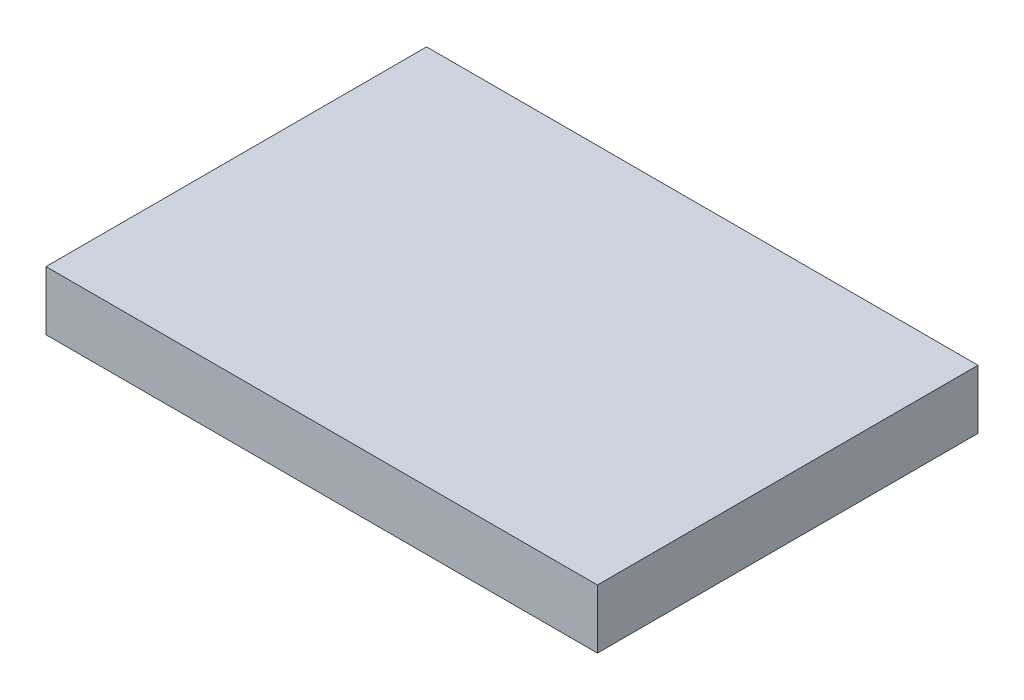
ISO-10303-21;
HEADER;
FILE_DESCRIPTION(('STEP AP214'),'2;1');
FILE_NAME('part.step','',(''),(''),'','','');
FILE_SCHEMA(('AUTOMOTIVE_DESIGN { 1 0 10303 214 1 1 1 1 }'));
ENDSEC;
DATA;
#1=APPLICATION_CONTEXT('core data for automotive mechanical design processes');
#2=APPLICATION_PROTOCOL_DEFINITION('international standard','automotive_design',2000,#1);
#3=PRODUCT_CONTEXT('',#1,'mechanical');
#4=PRODUCT('Part','Part','',(#3));
#5=PRODUCT_RELATED_PRODUCT_CATEGORY('part','',(#4));
#6=PRODUCT_DEFINITION_FORMATION('','',#4);
#7=PRODUCT_DEFINITION_CONTEXT('part definition',#1,'design');
#8=PRODUCT_DEFINITION('design','',#6,#7);
#9=PRODUCT_DEFINITION_SHAPE('','',#8);
#10=(LENGTH_UNIT() NAMED_UNIT(*) SI_UNIT(.MILLI.,.METRE.));
#11=(NAMED_UNIT(*) PLANE_ANGLE_UNIT() SI_UNIT($,.RADIAN.));
#12=(NAMED_UNIT(*) SI_UNIT($,.STERADIAN.) SOLID_ANGLE_UNIT());
#13=UNCERTAINTY_MEASURE_WITH_UNIT(LENGTH_MEASURE(1.E-05),#10,'distance_accuracy_value','');
#14=(GEOMETRIC_REPRESENTATION_CONTEXT(3) GLOBAL_UNCERTAINTY_ASSIGNED_CONTEXT((#13)) GLOBAL_UNIT_ASSIGNED_CONTEXT((#10,
#11,#12)) REPRESENTATION_CONTEXT('',''));
#15=CARTESIAN_POINT('',(0.,0.,0.));
#16=DIRECTION('',(0.,0.,1.));
#17=DIRECTION('',(1.,0.,0.));
#18=AXIS2_PLACEMENT_3D('',#15,#16,#17);
#19=CARTESIAN_POINT('',(0.,3.8,0.));
#20=DIRECTION('',(1.,0.,0.));
#21=DIRECTION('',(0.,0.,-1.));
#22=AXIS2_PLACEMENT_3D('',#19,#20,#21);
#23=PLANE('',#22);
#24=DIRECTION('',(0.,0.,1.));
#25=VECTOR('',#24,1.);
#26=CARTESIAN_POINT('',(0.,0.,0.));
#27=LINE('',#26,#25);
#28=CARTESIAN_POINT('',(0.,0.,0.));
#29=VERTEX_POINT('',#28);
#30=CARTESIAN_POINT('',(0.,0.,24.5));
#31=VERTEX_POINT('',#30);
#32=EDGE_CURVE('E102',#29,#31,#27,.T.);
#33=ORIENTED_EDGE('',*,*,#32,.T.);
#34=DIRECTION('',(0.,-1.,0.));
#35=VECTOR('',#34,1.);
#36=CARTESIAN_POINT('',(0.,3.8,24.5));
#37=LINE('',#36,#35);
#38=CARTESIAN_POINT('',(0.,3.8,24.5));
#39=VERTEX_POINT('',#38);
#40=EDGE_CURVE('E11',#39,#31,#37,.T.);
#41=ORIENTED_EDGE('',*,*,#40,.F.);
#42=DIRECTION('',(0.,0.,1.));
#43=VECTOR('',#42,1.);
#44=CARTESIAN_POINT('',(0.,3.8,0.));
#45=LINE('',#44,#43);
#46=CARTESIAN_POINT('',(0.,3.8,0.));
#47=VERTEX_POINT('',#46);
#48=EDGE_CURVE('E90',#47,#39,#45,.T.);
#49=ORIENTED_EDGE('',*,*,#48,.F.);
#50=DIRECTION('',(0.,-1.,0.));
#51=VECTOR('',#50,1.);
#52=CARTESIAN_POINT('',(0.,3.8,0.));
#53=LINE('',#52,#51);
#54=EDGE_CURVE('E98',#47,#29,#53,.T.);
#55=ORIENTED_EDGE('',*,*,#54,.T.);
#56=EDGE_LOOP('',(#33,#41,#49,#55));
#57=FACE_BOUND('',#56,.T.);
#58=ADVANCED_FACE('F39',(#57),#23,.F.);
#59=CARTESIAN_POINT('',(0.,3.8,24.5));
#60=DIRECTION('',(0.,0.,-1.));
#61=DIRECTION('',(-1.,0.,0.));
#62=AXIS2_PLACEMENT_3D('',#59,#60,#61);
#63=PLANE('',#62);
#64=DIRECTION('',(1.,0.,0.));
#65=VECTOR('',#64,1.);
#66=CARTESIAN_POINT('',(0.,0.,24.5));
#67=LINE('',#66,#65);
#68=CARTESIAN_POINT('',(35.5,0.,24.5));
#69=VERTEX_POINT('',#68);
#70=EDGE_CURVE('E94',#31,#69,#67,.T.);
#71=ORIENTED_EDGE('',*,*,#70,.T.);
#72=DIRECTION('',(0.,-1.,0.));
#73=VECTOR('',#72,1.);
#74=CARTESIAN_POINT('',(35.5,3.8,24.5));
#75=LINE('',#74,#73);
#76=CARTESIAN_POINT('',(35.5,3.8,24.5));
#77=VERTEX_POINT('',#76);
#78=EDGE_CURVE('E47',#77,#69,#75,.T.);
#79=ORIENTED_EDGE('',*,*,#78,.F.);
#80=DIRECTION('',(1.,0.,0.));
#81=VECTOR('',#80,1.);
#82=CARTESIAN_POINT('',(0.,3.8,24.5));
#83=LINE('',#82,#81);
#84=EDGE_CURVE('E85',#39,#77,#83,.T.);
#85=ORIENTED_EDGE('',*,*,#84,.F.);
#86=ORIENTED_EDGE('',*,*,#40,.T.);
#87=EDGE_LOOP('',(#71,#79,#85,#86));
#88=FACE_BOUND('',#87,.T.);
#89=ADVANCED_FACE('F93',(#88),#63,.F.);
#90=CARTESIAN_POINT('',(35.5,3.8,0.));
#91=DIRECTION('',(-1.,0.,0.));
#92=DIRECTION('',(0.,0.,1.));
#93=AXIS2_PLACEMENT_3D('',#90,#91,#92);
#94=PLANE('',#93);
#95=DIRECTION('',(0.,0.,-1.));
#96=VECTOR('',#95,1.);
#97=CARTESIAN_POINT('',(35.5,0.,0.));
#98=LINE('',#97,#96);
#99=CARTESIAN_POINT('',(35.5,0.,0.));
#100=VERTEX_POINT('',#99);
#101=EDGE_CURVE('E72',#69,#100,#98,.T.);
#102=ORIENTED_EDGE('',*,*,#101,.T.);
#103=DIRECTION('',(0.,-1.,0.));
#104=VECTOR('',#103,1.);
#105=CARTESIAN_POINT('',(35.5,3.8,0.));
#106=LINE('',#105,#104);
#107=CARTESIAN_POINT('',(35.5,3.8,0.));
#108=VERTEX_POINT('',#107);
#109=EDGE_CURVE('E95',#108,#100,#106,.T.);
#110=ORIENTED_EDGE('',*,*,#109,.F.);
#111=DIRECTION('',(0.,0.,-1.));
#112=VECTOR('',#111,1.);
#113=CARTESIAN_POINT('',(35.5,3.8,0.));
#114=LINE('',#113,#112);
#115=EDGE_CURVE('E88',#77,#108,#114,.T.);
#116=ORIENTED_EDGE('',*,*,#115,.F.);
#117=ORIENTED_EDGE('',*,*,#78,.T.);
#118=EDGE_LOOP('',(#102,#110,#116,#117));
#119=FACE_BOUND('',#118,.T.);
#120=ADVANCED_FACE('F96',(#119),#94,.F.);
#121=CARTESIAN_POINT('',(0.,3.8,0.));
#122=DIRECTION('',(0.,0.,1.));
#123=DIRECTION('',(1.,0.,0.));
#124=AXIS2_PLACEMENT_3D('',#121,#122,#123);
#125=PLANE('',#124);
#126=DIRECTION('',(-1.,0.,0.));
#127=VECTOR('',#126,1.);
#128=CARTESIAN_POINT('',(0.,0.,0.));
#129=LINE('',#128,#127);
#130=EDGE_CURVE('E78',#100,#29,#129,.T.);
#131=ORIENTED_EDGE('',*,*,#130,.T.);
#132=ORIENTED_EDGE('',*,*,#54,.F.);
#133=DIRECTION('',(-1.,0.,0.));
#134=VECTOR('',#133,1.);
#135=CARTESIAN_POINT('',(0.,3.8,0.));
#136=LINE('',#135,#134);
#137=EDGE_CURVE('E55',#108,#47,#136,.T.);
#138=ORIENTED_EDGE('',*,*,#137,.F.);
#139=ORIENTED_EDGE('',*,*,#109,.T.);
#140=EDGE_LOOP('',(#131,#132,#138,#139));
#141=FACE_BOUND('',#140,.T.);
#142=ADVANCED_FACE('F109',(#141),#125,.F.);
#143=CARTESIAN_POINT('',(0.,3.8,0.));
#144=DIRECTION('',(0.,1.,0.));
#145=DIRECTION('',(0.,0.,1.));
#146=AXIS2_PLACEMENT_3D('',#143,#144,#145);
#147=PLANE('',#146);
#148=ORIENTED_EDGE('',*,*,#48,.T.);
#149=ORIENTED_EDGE('',*,*,#84,.T.);
#150=ORIENTED_EDGE('',*,*,#115,.T.);
#151=ORIENTED_EDGE('',*,*,#137,.T.);
#152=EDGE_LOOP('',(#148,#149,#150,#151));
#153=FACE_BOUND('',#152,.T.);
#154=ADVANCED_FACE('F86',(#153),#147,.T.);
#155=CARTESIAN_POINT('',(0.,0.,0.));
#156=DIRECTION('',(0.,1.,0.));
#157=DIRECTION('',(0.,0.,1.));
#158=AXIS2_PLACEMENT_3D('',#155,#156,#157);
#159=PLANE('',#158);
#160=ORIENTED_EDGE('',*,*,#32,.F.);
#161=ORIENTED_EDGE('',*,*,#130,.F.);
#162=ORIENTED_EDGE('',*,*,#101,.F.);
#163=ORIENTED_EDGE('',*,*,#70,.F.);
#164=EDGE_LOOP('',(#160,#161,#162,#163));
#165=FACE_BOUND('',#164,.T.);
#166=ADVANCED_FACE('F112',(#165),#159,.F.);
#167=CLOSED_SHELL('',(#58,#89,#120,#142,#154,#166));
#168=MANIFOLD_SOLID_BREP('B2',#167);
#169=ADVANCED_BREP_SHAPE_REPRESENTATION('',(#18,#168),#14);
#170=SHAPE_DEFINITION_REPRESENTATION(#9,#169);
ENDSEC;
END-ISO-10303-21;
